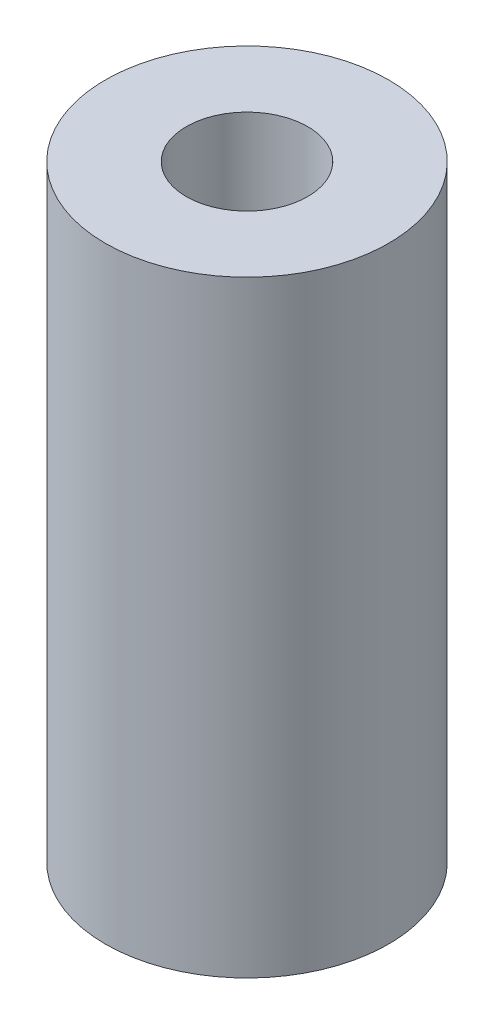
ISO-10303-21;
HEADER;
FILE_DESCRIPTION(('STEP AP214'),'2;1');
FILE_NAME('part.step','',(''),(''),'','','');
FILE_SCHEMA(('AUTOMOTIVE_DESIGN { 1 0 10303 214 1 1 1 1 }'));
ENDSEC;
DATA;
#1=APPLICATION_CONTEXT('core data for automotive mechanical design processes');
#2=APPLICATION_PROTOCOL_DEFINITION('international standard','automotive_design',2000,#1);
#3=PRODUCT_CONTEXT('',#1,'mechanical');
#4=PRODUCT('Part','Part','',(#3));
#5=PRODUCT_RELATED_PRODUCT_CATEGORY('part','',(#4));
#6=PRODUCT_DEFINITION_FORMATION('','',#4);
#7=PRODUCT_DEFINITION_CONTEXT('part definition',#1,'design');
#8=PRODUCT_DEFINITION('design','',#6,#7);
#9=PRODUCT_DEFINITION_SHAPE('','',#8);
#10=(LENGTH_UNIT() NAMED_UNIT(*) SI_UNIT(.MILLI.,.METRE.));
#11=(NAMED_UNIT(*) PLANE_ANGLE_UNIT() SI_UNIT($,.RADIAN.));
#12=(NAMED_UNIT(*) SI_UNIT($,.STERADIAN.) SOLID_ANGLE_UNIT());
#13=UNCERTAINTY_MEASURE_WITH_UNIT(LENGTH_MEASURE(1.E-05),#10,'distance_accuracy_value','');
#14=(GEOMETRIC_REPRESENTATION_CONTEXT(3) GLOBAL_UNCERTAINTY_ASSIGNED_CONTEXT((#13)) GLOBAL_UNIT_ASSIGNED_CONTEXT((#10,
#11,#12)) REPRESENTATION_CONTEXT('',''));
#15=CARTESIAN_POINT('',(0.,0.,0.));
#16=DIRECTION('',(0.,0.,1.));
#17=DIRECTION('',(1.,0.,0.));
#18=AXIS2_PLACEMENT_3D('',#15,#16,#17);
#19=CARTESIAN_POINT('',(0.,15.,0.));
#20=DIRECTION('',(0.,1.,0.));
#21=DIRECTION('',(0.,0.,1.));
#22=AXIS2_PLACEMENT_3D('',#19,#20,#21);
#23=PLANE('',#22);
#24=CARTESIAN_POINT('',(0.,15.,0.));
#25=DIRECTION('',(0.,1.,0.));
#26=DIRECTION('',(0.,0.,1.));
#27=AXIS2_PLACEMENT_3D('',#24,#25,#26);
#28=CIRCLE('',#27,3.5);
#29=CARTESIAN_POINT('',(0.,15.,3.5));
#30=VERTEX_POINT('',#29);
#31=EDGE_CURVE('E10',#30,#30,#28,.T.);
#32=ORIENTED_EDGE('',*,*,#31,.T.);
#33=EDGE_LOOP('',(#32));
#34=FACE_BOUND('',#33,.T.);
#35=CARTESIAN_POINT('',(0.,15.,0.));
#36=DIRECTION('',(0.,1.,0.));
#37=DIRECTION('',(0.,0.,1.));
#38=AXIS2_PLACEMENT_3D('',#35,#36,#37);
#39=CIRCLE('',#38,1.5);
#40=CARTESIAN_POINT('',(0.,15.,1.5));
#41=VERTEX_POINT('',#40);
#42=EDGE_CURVE('E50',#41,#41,#39,.T.);
#43=ORIENTED_EDGE('',*,*,#42,.F.);
#44=EDGE_LOOP('',(#43));
#45=FACE_BOUND('',#44,.T.);
#46=ADVANCED_FACE('F39',(#34,#45),#23,.T.);
#47=CARTESIAN_POINT('',(0.,0.,0.));
#48=DIRECTION('',(0.,1.,0.));
#49=DIRECTION('',(0.,0.,1.));
#50=AXIS2_PLACEMENT_3D('',#47,#48,#49);
#51=PLANE('',#50);
#52=CARTESIAN_POINT('',(0.,0.,0.));
#53=DIRECTION('',(0.,1.,0.));
#54=DIRECTION('',(0.,0.,1.));
#55=AXIS2_PLACEMENT_3D('',#52,#53,#54);
#56=CIRCLE('',#55,3.5);
#57=CARTESIAN_POINT('',(0.,0.,3.5));
#58=VERTEX_POINT('',#57);
#59=EDGE_CURVE('E43',#58,#58,#56,.T.);
#60=ORIENTED_EDGE('',*,*,#59,.F.);
#61=EDGE_LOOP('',(#60));
#62=FACE_BOUND('',#61,.T.);
#63=CARTESIAN_POINT('',(0.,0.,0.));
#64=DIRECTION('',(0.,1.,0.));
#65=DIRECTION('',(0.,0.,1.));
#66=AXIS2_PLACEMENT_3D('',#63,#64,#65);
#67=CIRCLE('',#66,1.5);
#68=CARTESIAN_POINT('',(0.,0.,1.5));
#69=VERTEX_POINT('',#68);
#70=EDGE_CURVE('E52',#69,#69,#67,.T.);
#71=ORIENTED_EDGE('',*,*,#70,.T.);
#72=EDGE_LOOP('',(#71));
#73=FACE_BOUND('',#72,.T.);
#74=ADVANCED_FACE('F62',(#62,#73),#51,.F.);
#75=CARTESIAN_POINT('',(0.,15.,0.));
#76=DIRECTION('',(0.,-1.,0.));
#77=DIRECTION('',(0.,0.,-1.));
#78=AXIS2_PLACEMENT_3D('',#75,#76,#77);
#79=CYLINDRICAL_SURFACE('',#78,3.5);
#80=ORIENTED_EDGE('',*,*,#31,.F.);
#81=EDGE_LOOP('',(#80));
#82=FACE_BOUND('',#81,.T.);
#83=ORIENTED_EDGE('',*,*,#59,.T.);
#84=EDGE_LOOP('',(#83));
#85=FACE_BOUND('',#84,.T.);
#86=ADVANCED_FACE('F41',(#82,#85),#79,.T.);
#87=CARTESIAN_POINT('',(0.,15.,0.));
#88=DIRECTION('',(0.,-1.,0.));
#89=DIRECTION('',(0.,0.,-1.));
#90=AXIS2_PLACEMENT_3D('',#87,#88,#89);
#91=CYLINDRICAL_SURFACE('',#90,1.5);
#92=ORIENTED_EDGE('',*,*,#42,.T.);
#93=EDGE_LOOP('',(#92));
#94=FACE_BOUND('',#93,.T.);
#95=ORIENTED_EDGE('',*,*,#70,.F.);
#96=EDGE_LOOP('',(#95));
#97=FACE_BOUND('',#96,.T.);
#98=ADVANCED_FACE('F58',(#94,#97),#91,.F.);
#99=CLOSED_SHELL('',(#46,#74,#86,#98));
#100=MANIFOLD_SOLID_BREP('B2',#99);
#101=ADVANCED_BREP_SHAPE_REPRESENTATION('',(#18,#100),#14);
#102=SHAPE_DEFINITION_REPRESENTATION(#9,#101);
ENDSEC;
END-ISO-10303-21;
